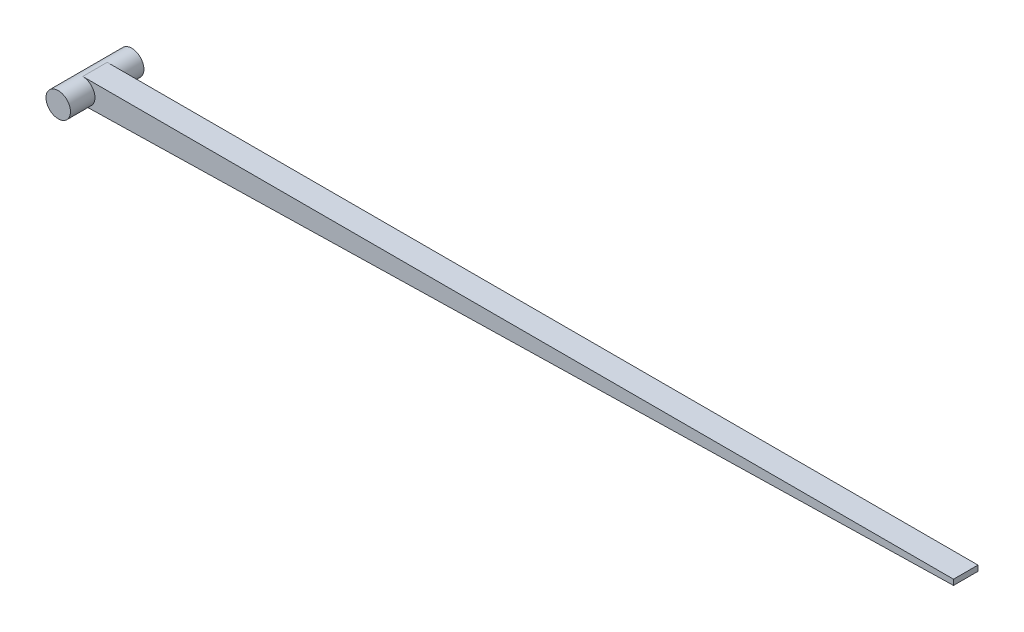
ISO-10303-21;
HEADER;
FILE_DESCRIPTION(('STEP AP214'),'2;1');
FILE_NAME('part.step','',(''),(''),'','','');
FILE_SCHEMA(('AUTOMOTIVE_DESIGN { 1 0 10303 214 1 1 1 1 }'));
ENDSEC;
DATA;
#1=APPLICATION_CONTEXT('core data for automotive mechanical design processes');
#2=APPLICATION_PROTOCOL_DEFINITION('international standard','automotive_design',2000,#1);
#3=PRODUCT_CONTEXT('',#1,'mechanical');
#4=PRODUCT('Part','Part','',(#3));
#5=PRODUCT_RELATED_PRODUCT_CATEGORY('part','',(#4));
#6=PRODUCT_DEFINITION_FORMATION('','',#4);
#7=PRODUCT_DEFINITION_CONTEXT('part definition',#1,'design');
#8=PRODUCT_DEFINITION('design','',#6,#7);
#9=PRODUCT_DEFINITION_SHAPE('','',#8);
#10=(LENGTH_UNIT() NAMED_UNIT(*) SI_UNIT(.MILLI.,.METRE.));
#11=(NAMED_UNIT(*) PLANE_ANGLE_UNIT() SI_UNIT($,.RADIAN.));
#12=(NAMED_UNIT(*) SI_UNIT($,.STERADIAN.) SOLID_ANGLE_UNIT());
#13=UNCERTAINTY_MEASURE_WITH_UNIT(LENGTH_MEASURE(1.E-05),#10,'distance_accuracy_value','');
#14=(GEOMETRIC_REPRESENTATION_CONTEXT(3) GLOBAL_UNCERTAINTY_ASSIGNED_CONTEXT((#13)) GLOBAL_UNIT_ASSIGNED_CONTEXT((#10,
#11,#12)) REPRESENTATION_CONTEXT('',''));
#15=CARTESIAN_POINT('',(0.,0.,0.));
#16=DIRECTION('',(0.,0.,1.));
#17=DIRECTION('',(1.,0.,0.));
#18=AXIS2_PLACEMENT_3D('',#15,#16,#17);
#19=CARTESIAN_POINT('',(1600.,-9.99999999999999,45.));
#20=DIRECTION('',(-0.0218697681129315,0.999760828019725,0.));
#21=DIRECTION('',(-0.999760828019725,-0.0218697681129315,0.));
#22=AXIS2_PLACEMENT_3D('',#19,#20,#21);
#23=PLANE('',#22);
#24=DIRECTION('',(0.999760828019725,0.0218697681129315,0.));
#25=VECTOR('',#24,1.);
#26=CARTESIAN_POINT('',(1600.,-9.99999999999999,45.));
#27=LINE('',#26,#25);
#28=CARTESIAN_POINT('',(0.983904186473388,-44.9784770959209,45.));
#29=VERTEX_POINT('',#28);
#30=CARTESIAN_POINT('',(1600.,-9.99999999999999,45.));
#31=VERTEX_POINT('',#30);
#32=EDGE_CURVE('E80',#29,#31,#27,.T.);
#33=ORIENTED_EDGE('',*,*,#32,.F.);
#34=DIRECTION('',(0.,0.,1.));
#35=VECTOR('',#34,1.);
#36=CARTESIAN_POINT('',(0.983904186473608,-44.9784770959209,-45.));
#37=LINE('',#36,#35);
#38=CARTESIAN_POINT('',(0.983904186473388,-44.9784770959209,0.));
#39=VERTEX_POINT('',#38);
#40=EDGE_CURVE('E93',#29,#39,#37,.F.);
#41=ORIENTED_EDGE('',*,*,#40,.T.);
#42=DIRECTION('',(0.999760828019725,0.0218697681129315,0.));
#43=VECTOR('',#42,1.);
#44=CARTESIAN_POINT('',(1600.,-9.99999999999999,0.));
#45=LINE('',#44,#43);
#46=CARTESIAN_POINT('',(1600.,-9.99999999999999,0.));
#47=VERTEX_POINT('',#46);
#48=EDGE_CURVE('E84',#39,#47,#45,.T.);
#49=ORIENTED_EDGE('',*,*,#48,.T.);
#50=DIRECTION('',(0.,0.,-1.));
#51=VECTOR('',#50,1.);
#52=CARTESIAN_POINT('',(1600.,-9.99999999999999,45.));
#53=LINE('',#52,#51);
#54=EDGE_CURVE('E48',#31,#47,#53,.T.);
#55=ORIENTED_EDGE('',*,*,#54,.F.);
#56=EDGE_LOOP('',(#33,#41,#49,#55));
#57=FACE_BOUND('',#56,.T.);
#58=ADVANCED_FACE('F39',(#57),#23,.F.);
#59=CARTESIAN_POINT('',(1600.,0.,45.));
#60=DIRECTION('',(-1.,0.,0.));
#61=DIRECTION('',(0.,0.,1.));
#62=AXIS2_PLACEMENT_3D('',#59,#60,#61);
#63=PLANE('',#62);
#64=DIRECTION('',(0.,1.,0.));
#65=VECTOR('',#64,1.);
#66=CARTESIAN_POINT('',(1600.,0.,0.));
#67=LINE('',#66,#65);
#68=CARTESIAN_POINT('',(1600.,0.,0.));
#69=VERTEX_POINT('',#68);
#70=EDGE_CURVE('E87',#47,#69,#67,.T.);
#71=ORIENTED_EDGE('',*,*,#70,.T.);
#72=DIRECTION('',(0.,0.,-1.));
#73=VECTOR('',#72,1.);
#74=CARTESIAN_POINT('',(1600.,0.,45.));
#75=LINE('',#74,#73);
#76=CARTESIAN_POINT('',(1600.,0.,45.));
#77=VERTEX_POINT('',#76);
#78=EDGE_CURVE('E104',#77,#69,#75,.T.);
#79=ORIENTED_EDGE('',*,*,#78,.F.);
#80=DIRECTION('',(0.,1.,0.));
#81=VECTOR('',#80,1.);
#82=CARTESIAN_POINT('',(1600.,0.,45.));
#83=LINE('',#82,#81);
#84=EDGE_CURVE('E110',#31,#77,#83,.T.);
#85=ORIENTED_EDGE('',*,*,#84,.F.);
#86=ORIENTED_EDGE('',*,*,#54,.T.);
#87=EDGE_LOOP('',(#71,#79,#85,#86));
#88=FACE_BOUND('',#87,.T.);
#89=ADVANCED_FACE('F137',(#88),#63,.F.);
#90=CARTESIAN_POINT('',(0.,0.,45.));
#91=DIRECTION('',(0.,-1.,0.));
#92=DIRECTION('',(0.,0.,-1.));
#93=AXIS2_PLACEMENT_3D('',#90,#91,#92);
#94=PLANE('',#93);
#95=DIRECTION('',(-1.,0.,0.));
#96=VECTOR('',#95,1.);
#97=CARTESIAN_POINT('',(0.,0.,0.));
#98=LINE('',#97,#96);
#99=CARTESIAN_POINT('',(0.,0.,0.));
#100=VERTEX_POINT('',#99);
#101=EDGE_CURVE('E113',#69,#100,#98,.T.);
#102=ORIENTED_EDGE('',*,*,#101,.T.);
#103=DIRECTION('',(0.,0.,-1.));
#104=VECTOR('',#103,1.);
#105=CARTESIAN_POINT('',(0.,0.,45.));
#106=LINE('',#105,#104);
#107=CARTESIAN_POINT('',(0.,0.,45.));
#108=VERTEX_POINT('',#107);
#109=EDGE_CURVE('E101',#108,#100,#106,.T.);
#110=ORIENTED_EDGE('',*,*,#109,.F.);
#111=DIRECTION('',(-1.,0.,0.));
#112=VECTOR('',#111,1.);
#113=CARTESIAN_POINT('',(0.,0.,45.));
#114=LINE('',#113,#112);
#115=EDGE_CURVE('E62',#77,#108,#114,.T.);
#116=ORIENTED_EDGE('',*,*,#115,.F.);
#117=ORIENTED_EDGE('',*,*,#78,.T.);
#118=EDGE_LOOP('',(#102,#110,#116,#117));
#119=FACE_BOUND('',#118,.T.);
#120=ADVANCED_FACE('F135',(#119),#94,.F.);
#121=CARTESIAN_POINT('',(0.,0.,45.));
#122=DIRECTION('',(0.,0.,-1.));
#123=DIRECTION('',(-1.,0.,0.));
#124=AXIS2_PLACEMENT_3D('',#121,#122,#123);
#125=PLANE('',#124);
#126=ORIENTED_EDGE('',*,*,#115,.T.);
#127=CARTESIAN_POINT('',(0.,-22.5,45.));
#128=DIRECTION('',(0.,0.,-1.));
#129=DIRECTION('',(-1.,0.,0.));
#130=AXIS2_PLACEMENT_3D('',#127,#128,#129);
#131=CIRCLE('',#130,22.5);
#132=EDGE_CURVE('E56',#108,#29,#131,.T.);
#133=ORIENTED_EDGE('',*,*,#132,.T.);
#134=ORIENTED_EDGE('',*,*,#32,.T.);
#135=ORIENTED_EDGE('',*,*,#84,.T.);
#136=EDGE_LOOP('',(#126,#133,#134,#135));
#137=FACE_BOUND('',#136,.T.);
#138=ADVANCED_FACE('F138',(#137),#125,.F.);
#139=CARTESIAN_POINT('',(0.,0.,0.));
#140=DIRECTION('',(0.,0.,-1.));
#141=DIRECTION('',(-1.,0.,0.));
#142=AXIS2_PLACEMENT_3D('',#139,#140,#141);
#143=PLANE('',#142);
#144=CARTESIAN_POINT('',(0.,-22.5,0.));
#145=DIRECTION('',(0.,0.,-1.));
#146=DIRECTION('',(-1.,0.,0.));
#147=AXIS2_PLACEMENT_3D('',#144,#145,#146);
#148=CIRCLE('',#147,22.5);
#149=EDGE_CURVE('E11',#100,#39,#148,.T.);
#150=ORIENTED_EDGE('',*,*,#149,.F.);
#151=ORIENTED_EDGE('',*,*,#101,.F.);
#152=ORIENTED_EDGE('',*,*,#70,.F.);
#153=ORIENTED_EDGE('',*,*,#48,.F.);
#154=EDGE_LOOP('',(#150,#151,#152,#153));
#155=FACE_BOUND('',#154,.T.);
#156=ADVANCED_FACE('F86',(#155),#143,.T.);
#157=CARTESIAN_POINT('',(0.,-22.5,-45.));
#158=DIRECTION('',(0.,0.,1.));
#159=DIRECTION('',(1.,0.,0.));
#160=AXIS2_PLACEMENT_3D('',#157,#158,#159);
#161=CYLINDRICAL_SURFACE('',#160,22.5);
#162=ORIENTED_EDGE('',*,*,#40,.F.);
#163=ORIENTED_EDGE('',*,*,#132,.F.);
#164=ORIENTED_EDGE('',*,*,#109,.T.);
#165=ORIENTED_EDGE('',*,*,#149,.T.);
#166=EDGE_LOOP('',(#162,#163,#164,#165));
#167=FACE_BOUND('',#166,.T.);
#168=CARTESIAN_POINT('',(0.,-22.5,90.));
#169=DIRECTION('',(0.,0.,1.));
#170=DIRECTION('',(1.,0.,0.));
#171=AXIS2_PLACEMENT_3D('',#168,#169,#170);
#172=CIRCLE('',#171,22.5);
#173=CARTESIAN_POINT('',(22.5,-22.5,90.));
#174=VERTEX_POINT('',#173);
#175=EDGE_CURVE('E203',#174,#174,#172,.T.);
#176=ORIENTED_EDGE('',*,*,#175,.F.);
#177=EDGE_LOOP('',(#176));
#178=FACE_BOUND('',#177,.T.);
#179=CARTESIAN_POINT('',(0.,-22.5,-45.));
#180=DIRECTION('',(0.,0.,1.));
#181=DIRECTION('',(1.,0.,0.));
#182=AXIS2_PLACEMENT_3D('',#179,#180,#181);
#183=CIRCLE('',#182,22.5);
#184=CARTESIAN_POINT('',(22.5,-22.5,-45.));
#185=VERTEX_POINT('',#184);
#186=EDGE_CURVE('E96',#185,#185,#183,.T.);
#187=ORIENTED_EDGE('',*,*,#186,.T.);
#188=EDGE_LOOP('',(#187));
#189=FACE_BOUND('',#188,.T.);
#190=ADVANCED_FACE('F99',(#167,#178,#189),#161,.T.);
#191=CARTESIAN_POINT('',(0.,-22.5,-45.));
#192=DIRECTION('',(0.,0.,1.));
#193=DIRECTION('',(1.,0.,0.));
#194=AXIS2_PLACEMENT_3D('',#191,#192,#193);
#195=PLANE('',#194);
#196=ORIENTED_EDGE('',*,*,#186,.F.);
#197=EDGE_LOOP('',(#196));
#198=FACE_BOUND('',#197,.T.);
#199=ADVANCED_FACE('F179',(#198),#195,.F.);
#200=CARTESIAN_POINT('',(0.,-22.5,90.));
#201=DIRECTION('',(0.,0.,1.));
#202=DIRECTION('',(1.,0.,0.));
#203=AXIS2_PLACEMENT_3D('',#200,#201,#202);
#204=PLANE('',#203);
#205=ORIENTED_EDGE('',*,*,#175,.T.);
#206=EDGE_LOOP('',(#205));
#207=FACE_BOUND('',#206,.T.);
#208=ADVANCED_FACE('F187',(#207),#204,.T.);
#209=CLOSED_SHELL('',(#58,#89,#120,#138,#156,#190,#199,#208));
#210=MANIFOLD_SOLID_BREP('B2',#209);
#211=ADVANCED_BREP_SHAPE_REPRESENTATION('',(#18,#210),#14);
#212=SHAPE_DEFINITION_REPRESENTATION(#9,#211);
ENDSEC;
END-ISO-10303-21;
